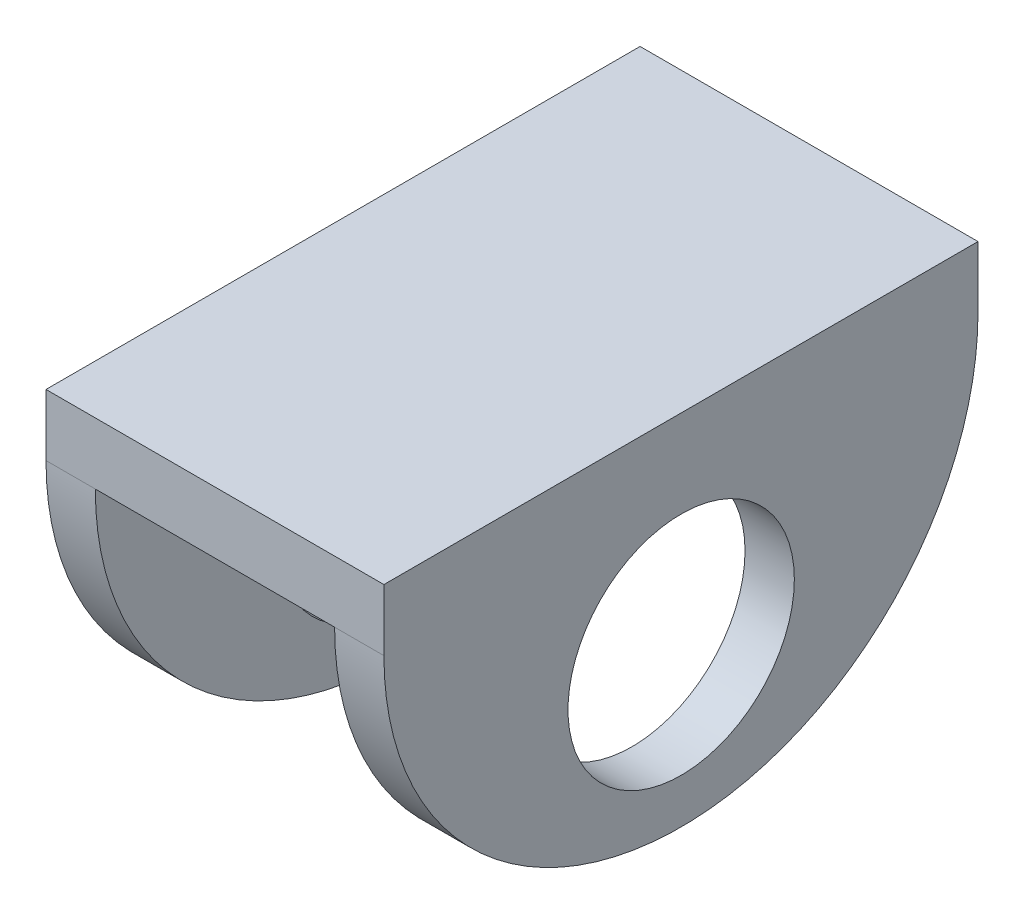
ISO-10303-21;
HEADER;
FILE_DESCRIPTION(('STEP AP214'),'2;1');
FILE_NAME('part.step','',(''),(''),'','','');
FILE_SCHEMA(('AUTOMOTIVE_DESIGN { 1 0 10303 214 1 1 1 1 }'));
ENDSEC;
DATA;
#1=APPLICATION_CONTEXT('core data for automotive mechanical design processes');
#2=APPLICATION_PROTOCOL_DEFINITION('international standard','automotive_design',2000,#1);
#3=PRODUCT_CONTEXT('',#1,'mechanical');
#4=PRODUCT('Part','Part','',(#3));
#5=PRODUCT_RELATED_PRODUCT_CATEGORY('part','',(#4));
#6=PRODUCT_DEFINITION_FORMATION('','',#4);
#7=PRODUCT_DEFINITION_CONTEXT('part definition',#1,'design');
#8=PRODUCT_DEFINITION('design','',#6,#7);
#9=PRODUCT_DEFINITION_SHAPE('','',#8);
#10=(LENGTH_UNIT() NAMED_UNIT(*) SI_UNIT(.MILLI.,.METRE.));
#11=(NAMED_UNIT(*) PLANE_ANGLE_UNIT() SI_UNIT($,.RADIAN.));
#12=(NAMED_UNIT(*) SI_UNIT($,.STERADIAN.) SOLID_ANGLE_UNIT());
#13=UNCERTAINTY_MEASURE_WITH_UNIT(LENGTH_MEASURE(1.E-05),#10,'distance_accuracy_value','');
#14=(GEOMETRIC_REPRESENTATION_CONTEXT(3) GLOBAL_UNCERTAINTY_ASSIGNED_CONTEXT((#13)) GLOBAL_UNIT_ASSIGNED_CONTEXT((#10,
#11,#12)) REPRESENTATION_CONTEXT('',''));
#15=CARTESIAN_POINT('',(0.,0.,0.));
#16=DIRECTION('',(0.,0.,1.));
#17=DIRECTION('',(1.,0.,0.));
#18=AXIS2_PLACEMENT_3D('',#15,#16,#17);
#19=CARTESIAN_POINT('',(-20.832572,576.134484,-134.05358));
#20=DIRECTION('',(0.,0.,1.));
#21=DIRECTION('',(1.,0.,0.));
#22=AXIS2_PLACEMENT_3D('',#19,#20,#21);
#23=PLANE('',#22);
#24=DIRECTION('',(1.,0.,0.));
#25=VECTOR('',#24,1.);
#26=CARTESIAN_POINT('',(-20.832572,565.412382,-134.05358));
#27=LINE('',#26,#25);
#28=CARTESIAN_POINT('',(-20.832572,565.412382,-134.05358));
#29=VERTEX_POINT('',#28);
#30=CARTESIAN_POINT('',(20.832572,565.412382,-134.05358));
#31=VERTEX_POINT('',#30);
#32=EDGE_CURVE('E36',#29,#31,#27,.T.);
#33=ORIENTED_EDGE('',*,*,#32,.T.);
#34=DIRECTION('',(-1.,0.,0.));
#35=VECTOR('',#34,1.);
#36=CARTESIAN_POINT('',(29.418788,565.412382,-134.05358));
#37=LINE('',#36,#35);
#38=CARTESIAN_POINT('',(29.418788,565.412382,-134.05358));
#39=VERTEX_POINT('',#38);
#40=EDGE_CURVE('E131',#39,#31,#37,.T.);
#41=ORIENTED_EDGE('',*,*,#40,.F.);
#42=DIRECTION('',(0.,-1.,0.));
#43=VECTOR('',#42,1.);
#44=CARTESIAN_POINT('',(29.418788,565.412382,-134.05358));
#45=LINE('',#44,#43);
#46=CARTESIAN_POINT('',(29.418788,576.134484,-134.05358));
#47=VERTEX_POINT('',#46);
#48=EDGE_CURVE('E129',#47,#39,#45,.T.);
#49=ORIENTED_EDGE('',*,*,#48,.F.);
#50=DIRECTION('',(1.,0.,0.));
#51=VECTOR('',#50,1.);
#52=CARTESIAN_POINT('',(-20.832572,576.134484,-134.05358));
#53=LINE('',#52,#51);
#54=CARTESIAN_POINT('',(-29.418788,576.134484,-134.05358));
#55=VERTEX_POINT('',#54);
#56=EDGE_CURVE('E11',#55,#47,#53,.T.);
#57=ORIENTED_EDGE('',*,*,#56,.F.);
#58=DIRECTION('',(0.,-1.,0.));
#59=VECTOR('',#58,1.);
#60=CARTESIAN_POINT('',(-29.418788,565.412382,-134.05358));
#61=LINE('',#60,#59);
#62=CARTESIAN_POINT('',(-29.418788,565.412382,-134.05358));
#63=VERTEX_POINT('',#62);
#64=EDGE_CURVE('E99',#55,#63,#61,.T.);
#65=ORIENTED_EDGE('',*,*,#64,.T.);
#66=DIRECTION('',(1.,0.,0.));
#67=VECTOR('',#66,1.);
#68=CARTESIAN_POINT('',(-29.418788,565.412382,-134.05358));
#69=LINE('',#68,#67);
#70=EDGE_CURVE('E86',#63,#29,#69,.T.);
#71=ORIENTED_EDGE('',*,*,#70,.T.);
#72=EDGE_LOOP('',(#33,#41,#49,#57,#65,#71));
#73=FACE_BOUND('',#72,.T.);
#74=ADVANCED_FACE('F33',(#73),#23,.T.);
#75=CARTESIAN_POINT('',(-20.832572,576.134484,-134.05358));
#76=DIRECTION('',(0.,1.,0.));
#77=DIRECTION('',(0.,0.,1.));
#78=AXIS2_PLACEMENT_3D('',#75,#76,#77);
#79=PLANE('',#78);
#80=ORIENTED_EDGE('',*,*,#56,.T.);
#81=DIRECTION('',(0.,0.,1.));
#82=VECTOR('',#81,1.);
#83=CARTESIAN_POINT('',(29.418788,576.134484,-134.05358));
#84=LINE('',#83,#82);
#85=CARTESIAN_POINT('',(29.418788,576.134484,-237.493556));
#86=VERTEX_POINT('',#85);
#87=EDGE_CURVE('E126',#86,#47,#84,.T.);
#88=ORIENTED_EDGE('',*,*,#87,.F.);
#89=DIRECTION('',(1.,0.,0.));
#90=VECTOR('',#89,1.);
#91=CARTESIAN_POINT('',(-20.832572,576.134484,-237.493556));
#92=LINE('',#91,#90);
#93=CARTESIAN_POINT('',(-29.418788,576.134484,-237.493556));
#94=VERTEX_POINT('',#93);
#95=EDGE_CURVE('E41',#94,#86,#92,.T.);
#96=ORIENTED_EDGE('',*,*,#95,.F.);
#97=DIRECTION('',(0.,0.,1.));
#98=VECTOR('',#97,1.);
#99=CARTESIAN_POINT('',(-29.418788,576.134484,-134.05358));
#100=LINE('',#99,#98);
#101=EDGE_CURVE('E105',#94,#55,#100,.T.);
#102=ORIENTED_EDGE('',*,*,#101,.T.);
#103=EDGE_LOOP('',(#80,#88,#96,#102));
#104=FACE_BOUND('',#103,.T.);
#105=ADVANCED_FACE('F163',(#104),#79,.T.);
#106=CARTESIAN_POINT('',(-20.832572,576.134484,-237.493556));
#107=DIRECTION('',(0.,0.,-1.));
#108=DIRECTION('',(-1.,0.,0.));
#109=AXIS2_PLACEMENT_3D('',#106,#107,#108);
#110=PLANE('',#109);
#111=ORIENTED_EDGE('',*,*,#95,.T.);
#112=DIRECTION('',(0.,1.,0.));
#113=VECTOR('',#112,1.);
#114=CARTESIAN_POINT('',(29.418788,576.134484,-237.493556));
#115=LINE('',#114,#113);
#116=CARTESIAN_POINT('',(29.418788,565.412382,-237.493556));
#117=VERTEX_POINT('',#116);
#118=EDGE_CURVE('E123',#117,#86,#115,.T.);
#119=ORIENTED_EDGE('',*,*,#118,.F.);
#120=DIRECTION('',(-1.,0.,0.));
#121=VECTOR('',#120,1.);
#122=CARTESIAN_POINT('',(29.418788,565.412382,-237.493556));
#123=LINE('',#122,#121);
#124=CARTESIAN_POINT('',(20.832572,565.412382,-237.493556));
#125=VERTEX_POINT('',#124);
#126=EDGE_CURVE('E136',#117,#125,#123,.T.);
#127=ORIENTED_EDGE('',*,*,#126,.T.);
#128=DIRECTION('',(1.,0.,0.));
#129=VECTOR('',#128,1.);
#130=CARTESIAN_POINT('',(-20.832572,565.412382,-237.493556));
#131=LINE('',#130,#129);
#132=CARTESIAN_POINT('',(-20.832572,565.412382,-237.493556));
#133=VERTEX_POINT('',#132);
#134=EDGE_CURVE('E145',#133,#125,#131,.T.);
#135=ORIENTED_EDGE('',*,*,#134,.F.);
#136=DIRECTION('',(1.,0.,0.));
#137=VECTOR('',#136,1.);
#138=CARTESIAN_POINT('',(-29.418788,565.412382,-237.493556));
#139=LINE('',#138,#137);
#140=CARTESIAN_POINT('',(-29.418788,565.412382,-237.493556));
#141=VERTEX_POINT('',#140);
#142=EDGE_CURVE('E93',#141,#133,#139,.T.);
#143=ORIENTED_EDGE('',*,*,#142,.F.);
#144=DIRECTION('',(0.,1.,0.));
#145=VECTOR('',#144,1.);
#146=CARTESIAN_POINT('',(-29.418788,576.134484,-237.493556));
#147=LINE('',#146,#145);
#148=EDGE_CURVE('E102',#141,#94,#147,.T.);
#149=ORIENTED_EDGE('',*,*,#148,.T.);
#150=EDGE_LOOP('',(#111,#119,#127,#135,#143,#149));
#151=FACE_BOUND('',#150,.T.);
#152=ADVANCED_FACE('F154',(#151),#110,.T.);
#153=CARTESIAN_POINT('',(-20.832572,565.412382,-134.05358));
#154=DIRECTION('',(0.,-1.,0.));
#155=DIRECTION('',(0.,0.,-1.));
#156=AXIS2_PLACEMENT_3D('',#153,#154,#155);
#157=PLANE('',#156);
#158=ORIENTED_EDGE('',*,*,#134,.T.);
#159=DIRECTION('',(0.,0.,-1.));
#160=VECTOR('',#159,1.);
#161=CARTESIAN_POINT('',(20.832572,565.412382,-134.05358));
#162=LINE('',#161,#160);
#163=EDGE_CURVE('E139',#31,#125,#162,.T.);
#164=ORIENTED_EDGE('',*,*,#163,.F.);
#165=ORIENTED_EDGE('',*,*,#32,.F.);
#166=DIRECTION('',(0.,0.,-1.));
#167=VECTOR('',#166,1.);
#168=CARTESIAN_POINT('',(-20.832572,565.412382,-134.05358));
#169=LINE('',#168,#167);
#170=EDGE_CURVE('E142',#29,#133,#169,.T.);
#171=ORIENTED_EDGE('',*,*,#170,.T.);
#172=EDGE_LOOP('',(#158,#164,#165,#171));
#173=FACE_BOUND('',#172,.T.);
#174=ADVANCED_FACE('F148',(#173),#157,.T.);
#175=CARTESIAN_POINT('',(20.832572,565.412382,-185.773568));
#176=DIRECTION('',(1.,0.,0.));
#177=DIRECTION('',(0.,0.,-1.));
#178=AXIS2_PLACEMENT_3D('',#175,#176,#177);
#179=PLANE('',#178);
#180=CARTESIAN_POINT('',(20.832572,541.18891,-185.811668));
#181=DIRECTION('',(1.,0.,0.));
#182=DIRECTION('',(0.,0.,-1.));
#183=AXIS2_PLACEMENT_3D('',#180,#181,#182);
#184=CIRCLE('',#183,19.704892680801);
#185=CARTESIAN_POINT('',(20.832572,541.18891,-205.516560680801));
#186=VERTEX_POINT('',#185);
#187=EDGE_CURVE('E92',#186,#186,#184,.T.);
#188=ORIENTED_EDGE('',*,*,#187,.T.);
#189=EDGE_LOOP('',(#188));
#190=FACE_BOUND('',#189,.T.);
#191=CARTESIAN_POINT('',(20.832572,565.412382,-185.773568));
#192=DIRECTION('',(1.,0.,0.));
#193=DIRECTION('',(0.,0.,-1.));
#194=AXIS2_PLACEMENT_3D('',#191,#192,#193);
#195=CIRCLE('',#194,51.719988);
#196=EDGE_CURVE('E117',#31,#125,#195,.T.);
#197=ORIENTED_EDGE('',*,*,#196,.F.);
#198=ORIENTED_EDGE('',*,*,#163,.T.);
#199=EDGE_LOOP('',(#197,#198));
#200=FACE_BOUND('',#199,.T.);
#201=ADVANCED_FACE('F152',(#190,#200),#179,.F.);
#202=CARTESIAN_POINT('',(29.418788,565.412382,-185.773568));
#203=DIRECTION('',(1.,0.,0.));
#204=DIRECTION('',(0.,0.,-1.));
#205=AXIS2_PLACEMENT_3D('',#202,#203,#204);
#206=PLANE('',#205);
#207=CARTESIAN_POINT('',(29.418788,565.412382,-185.773568));
#208=DIRECTION('',(1.,0.,0.));
#209=DIRECTION('',(0.,0.,-1.));
#210=AXIS2_PLACEMENT_3D('',#207,#208,#209);
#211=CIRCLE('',#210,51.719988);
#212=EDGE_CURVE('E120',#39,#117,#211,.T.);
#213=ORIENTED_EDGE('',*,*,#212,.T.);
#214=ORIENTED_EDGE('',*,*,#118,.T.);
#215=ORIENTED_EDGE('',*,*,#87,.T.);
#216=ORIENTED_EDGE('',*,*,#48,.T.);
#217=EDGE_LOOP('',(#213,#214,#215,#216));
#218=FACE_BOUND('',#217,.T.);
#219=CARTESIAN_POINT('',(29.418788,541.18891,-185.811668));
#220=DIRECTION('',(1.,0.,0.));
#221=DIRECTION('',(0.,0.,-1.));
#222=AXIS2_PLACEMENT_3D('',#219,#220,#221);
#223=CIRCLE('',#222,19.704892680801);
#224=CARTESIAN_POINT('',(29.418788,541.18891,-205.516560680801));
#225=VERTEX_POINT('',#224);
#226=EDGE_CURVE('E114',#225,#225,#223,.T.);
#227=ORIENTED_EDGE('',*,*,#226,.F.);
#228=EDGE_LOOP('',(#227));
#229=FACE_BOUND('',#228,.T.);
#230=ADVANCED_FACE('F159',(#218,#229),#206,.T.);
#231=CARTESIAN_POINT('',(29.418788,565.412382,-185.773568));
#232=DIRECTION('',(-1.,0.,0.));
#233=DIRECTION('',(0.,0.,1.));
#234=AXIS2_PLACEMENT_3D('',#231,#232,#233);
#235=CYLINDRICAL_SURFACE('',#234,51.719988);
#236=ORIENTED_EDGE('',*,*,#196,.T.);
#237=ORIENTED_EDGE('',*,*,#126,.F.);
#238=ORIENTED_EDGE('',*,*,#212,.F.);
#239=ORIENTED_EDGE('',*,*,#40,.T.);
#240=EDGE_LOOP('',(#236,#237,#238,#239));
#241=FACE_BOUND('',#240,.T.);
#242=ADVANCED_FACE('F157',(#241),#235,.T.);
#243=CARTESIAN_POINT('',(29.418788,541.18891,-185.811668));
#244=DIRECTION('',(-1.,0.,0.));
#245=DIRECTION('',(0.,0.,1.));
#246=AXIS2_PLACEMENT_3D('',#243,#244,#245);
#247=CYLINDRICAL_SURFACE('',#246,19.704892680801);
#248=ORIENTED_EDGE('',*,*,#226,.T.);
#249=EDGE_LOOP('',(#248));
#250=FACE_BOUND('',#249,.T.);
#251=ORIENTED_EDGE('',*,*,#187,.F.);
#252=EDGE_LOOP('',(#251));
#253=FACE_BOUND('',#252,.T.);
#254=ADVANCED_FACE('F183',(#250,#253),#247,.F.);
#255=CARTESIAN_POINT('',(-29.418788,565.412382,-185.773568));
#256=DIRECTION('',(1.,0.,0.));
#257=DIRECTION('',(0.,0.,-1.));
#258=AXIS2_PLACEMENT_3D('',#255,#256,#257);
#259=CYLINDRICAL_SURFACE('',#258,51.719988);
#260=CARTESIAN_POINT('',(-20.832572,565.412382,-185.773568));
#261=DIRECTION('',(1.,0.,0.));
#262=DIRECTION('',(0.,0.,-1.));
#263=AXIS2_PLACEMENT_3D('',#260,#261,#262);
#264=CIRCLE('',#263,51.719988);
#265=EDGE_CURVE('E48',#29,#133,#264,.T.);
#266=ORIENTED_EDGE('',*,*,#265,.F.);
#267=ORIENTED_EDGE('',*,*,#70,.F.);
#268=CARTESIAN_POINT('',(-29.418788,565.412382,-185.773568));
#269=DIRECTION('',(1.,0.,0.));
#270=DIRECTION('',(0.,0.,-1.));
#271=AXIS2_PLACEMENT_3D('',#268,#269,#270);
#272=CIRCLE('',#271,51.719988);
#273=EDGE_CURVE('E89',#63,#141,#272,.T.);
#274=ORIENTED_EDGE('',*,*,#273,.T.);
#275=ORIENTED_EDGE('',*,*,#142,.T.);
#276=EDGE_LOOP('',(#266,#267,#274,#275));
#277=FACE_BOUND('',#276,.T.);
#278=ADVANCED_FACE('F88',(#277),#259,.T.);
#279=CARTESIAN_POINT('',(-29.418788,565.412382,-185.773568));
#280=DIRECTION('',(-1.,0.,0.));
#281=DIRECTION('',(0.,0.,-1.));
#282=AXIS2_PLACEMENT_3D('',#279,#280,#281);
#283=PLANE('',#282);
#284=CARTESIAN_POINT('',(-29.418788,541.18891,-185.811668));
#285=DIRECTION('',(1.,0.,0.));
#286=DIRECTION('',(0.,0.,-1.));
#287=AXIS2_PLACEMENT_3D('',#284,#285,#286);
#288=CIRCLE('',#287,19.704892680801);
#289=CARTESIAN_POINT('',(-29.418788,541.18891,-205.516560680801));
#290=VERTEX_POINT('',#289);
#291=EDGE_CURVE('E112',#290,#290,#288,.T.);
#292=ORIENTED_EDGE('',*,*,#291,.T.);
#293=EDGE_LOOP('',(#292));
#294=FACE_BOUND('',#293,.T.);
#295=ORIENTED_EDGE('',*,*,#273,.F.);
#296=ORIENTED_EDGE('',*,*,#64,.F.);
#297=ORIENTED_EDGE('',*,*,#101,.F.);
#298=ORIENTED_EDGE('',*,*,#148,.F.);
#299=EDGE_LOOP('',(#295,#296,#297,#298));
#300=FACE_BOUND('',#299,.T.);
#301=ADVANCED_FACE('F97',(#294,#300),#283,.T.);
#302=CARTESIAN_POINT('',(-20.832572,565.412382,-185.773568));
#303=DIRECTION('',(-1.,0.,0.));
#304=DIRECTION('',(0.,0.,-1.));
#305=AXIS2_PLACEMENT_3D('',#302,#303,#304);
#306=PLANE('',#305);
#307=ORIENTED_EDGE('',*,*,#170,.F.);
#308=ORIENTED_EDGE('',*,*,#265,.T.);
#309=EDGE_LOOP('',(#307,#308));
#310=FACE_BOUND('',#309,.T.);
#311=CARTESIAN_POINT('',(-20.832572,541.18891,-185.811668));
#312=DIRECTION('',(1.,0.,0.));
#313=DIRECTION('',(0.,0.,-1.));
#314=AXIS2_PLACEMENT_3D('',#311,#312,#313);
#315=CIRCLE('',#314,19.704892680801);
#316=CARTESIAN_POINT('',(-20.832572,541.18891,-205.516560680801));
#317=VERTEX_POINT('',#316);
#318=EDGE_CURVE('E205',#317,#317,#315,.T.);
#319=ORIENTED_EDGE('',*,*,#318,.F.);
#320=EDGE_LOOP('',(#319));
#321=FACE_BOUND('',#320,.T.);
#322=ADVANCED_FACE('F189',(#310,#321),#306,.F.);
#323=CARTESIAN_POINT('',(-29.418788,541.18891,-185.811668));
#324=DIRECTION('',(1.,0.,0.));
#325=DIRECTION('',(0.,0.,-1.));
#326=AXIS2_PLACEMENT_3D('',#323,#324,#325);
#327=CYLINDRICAL_SURFACE('',#326,19.704892680801);
#328=ORIENTED_EDGE('',*,*,#291,.F.);
#329=EDGE_LOOP('',(#328));
#330=FACE_BOUND('',#329,.T.);
#331=ORIENTED_EDGE('',*,*,#318,.T.);
#332=EDGE_LOOP('',(#331));
#333=FACE_BOUND('',#332,.T.);
#334=ADVANCED_FACE('F192',(#330,#333),#327,.F.);
#335=CLOSED_SHELL('',(#74,#105,#152,#174,#201,#230,#242,#254,#278,#301,#322,#334));
#336=MANIFOLD_SOLID_BREP('B2',#335);
#337=ADVANCED_BREP_SHAPE_REPRESENTATION('',(#18,#336),#14);
#338=SHAPE_DEFINITION_REPRESENTATION(#9,#337);
ENDSEC;
END-ISO-10303-21;
